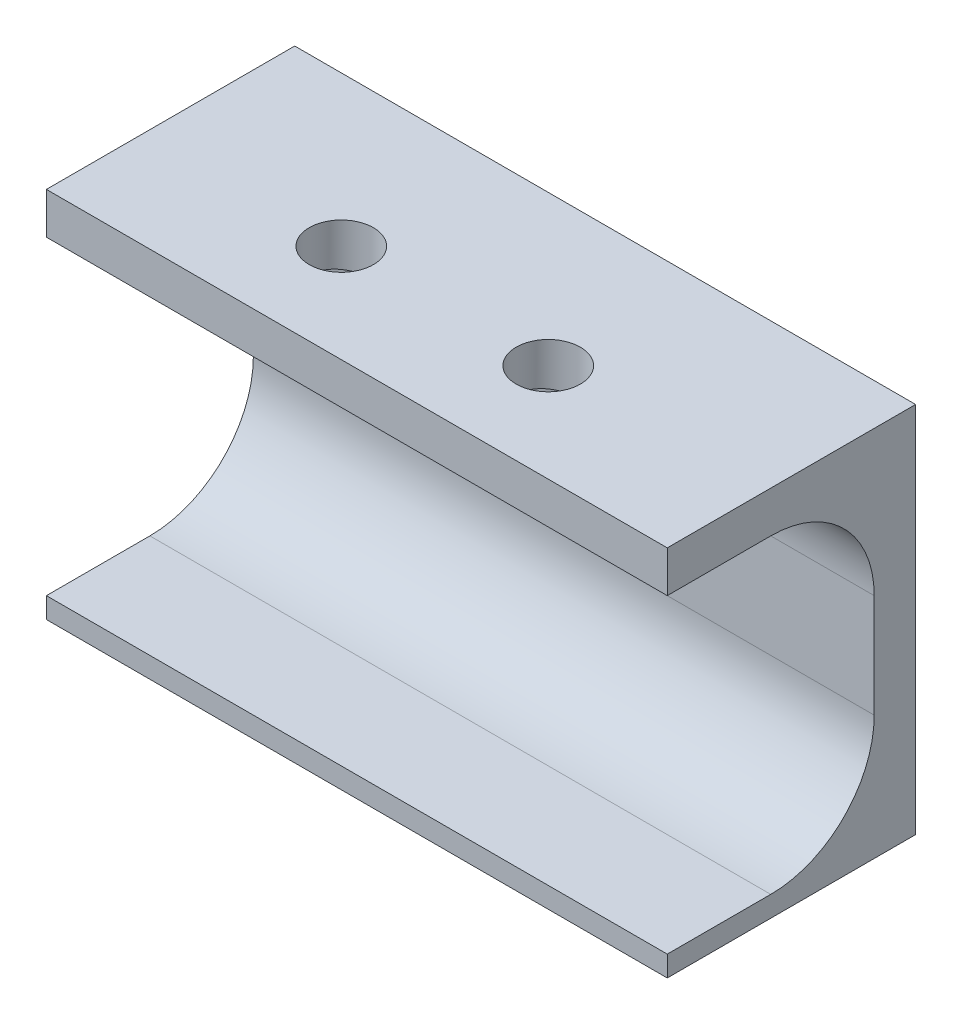
ISO-10303-21;
HEADER;
FILE_DESCRIPTION(('STEP AP214'),'2;1');
FILE_NAME('part.step','',(''),(''),'','','');
FILE_SCHEMA(('AUTOMOTIVE_DESIGN { 1 0 10303 214 1 1 1 1 }'));
ENDSEC;
DATA;
#1=APPLICATION_CONTEXT('core data for automotive mechanical design processes');
#2=APPLICATION_PROTOCOL_DEFINITION('international standard','automotive_design',2000,#1);
#3=PRODUCT_CONTEXT('',#1,'mechanical');
#4=PRODUCT('Part','Part','',(#3));
#5=PRODUCT_RELATED_PRODUCT_CATEGORY('part','',(#4));
#6=PRODUCT_DEFINITION_FORMATION('','',#4);
#7=PRODUCT_DEFINITION_CONTEXT('part definition',#1,'design');
#8=PRODUCT_DEFINITION('design','',#6,#7);
#9=PRODUCT_DEFINITION_SHAPE('','',#8);
#10=(LENGTH_UNIT() NAMED_UNIT(*) SI_UNIT(.MILLI.,.METRE.));
#11=(NAMED_UNIT(*) PLANE_ANGLE_UNIT() SI_UNIT($,.RADIAN.));
#12=(NAMED_UNIT(*) SI_UNIT($,.STERADIAN.) SOLID_ANGLE_UNIT());
#13=UNCERTAINTY_MEASURE_WITH_UNIT(LENGTH_MEASURE(1.E-05),#10,'distance_accuracy_value','');
#14=(GEOMETRIC_REPRESENTATION_CONTEXT(3) GLOBAL_UNCERTAINTY_ASSIGNED_CONTEXT((#13)) GLOBAL_UNIT_ASSIGNED_CONTEXT((#10,
#11,#12)) REPRESENTATION_CONTEXT('',''));
#15=CARTESIAN_POINT('',(0.,0.,0.));
#16=DIRECTION('',(0.,0.,1.));
#17=DIRECTION('',(1.,0.,0.));
#18=AXIS2_PLACEMENT_3D('',#15,#16,#17);
#19=CARTESIAN_POINT('',(30.,-1.39041349283809,11.5391489287265));
#20=DIRECTION('',(0.,0.,-1.));
#21=DIRECTION('',(-1.,0.,0.));
#22=AXIS2_PLACEMENT_3D('',#19,#20,#21);
#23=PLANE('',#22);
#24=DIRECTION('',(0.,-1.,0.));
#25=VECTOR('',#24,1.);
#26=CARTESIAN_POINT('',(0.,-1.39041349283809,11.5391489287265));
#27=LINE('',#26,#25);
#28=CARTESIAN_POINT('',(0.,-0.390413492838092,11.5391489287265));
#29=VERTEX_POINT('',#28);
#30=CARTESIAN_POINT('',(0.,-1.39041349283809,11.5391489287265));
#31=VERTEX_POINT('',#30);
#32=EDGE_CURVE('E230',#29,#31,#27,.T.);
#33=ORIENTED_EDGE('',*,*,#32,.T.);
#34=DIRECTION('',(-1.,0.,0.));
#35=VECTOR('',#34,1.);
#36=CARTESIAN_POINT('',(30.,-1.39041349283809,11.5391489287265));
#37=LINE('',#36,#35);
#38=CARTESIAN_POINT('',(30.,-1.39041349283809,11.5391489287265));
#39=VERTEX_POINT('',#38);
#40=EDGE_CURVE('E142',#39,#31,#37,.T.);
#41=ORIENTED_EDGE('',*,*,#40,.F.);
#42=DIRECTION('',(0.,-1.,0.));
#43=VECTOR('',#42,1.);
#44=CARTESIAN_POINT('',(30.,-1.39041349283809,11.5391489287265));
#45=LINE('',#44,#43);
#46=CARTESIAN_POINT('',(30.,-0.390413492838092,11.5391489287265));
#47=VERTEX_POINT('',#46);
#48=EDGE_CURVE('E270',#47,#39,#45,.T.);
#49=ORIENTED_EDGE('',*,*,#48,.F.);
#50=DIRECTION('',(-1.,0.,0.));
#51=VECTOR('',#50,1.);
#52=CARTESIAN_POINT('',(30.,-0.390413492838092,11.5391489287265));
#53=LINE('',#52,#51);
#54=EDGE_CURVE('E233',#47,#29,#53,.T.);
#55=ORIENTED_EDGE('',*,*,#54,.T.);
#56=EDGE_LOOP('',(#33,#41,#49,#55));
#57=FACE_BOUND('',#56,.T.);
#58=ADVANCED_FACE('F47',(#57),#23,.F.);
#59=CARTESIAN_POINT('',(30.,-1.39041349283809,11.5391489287265));
#60=DIRECTION('',(0.,1.,0.));
#61=DIRECTION('',(0.,0.,1.));
#62=AXIS2_PLACEMENT_3D('',#59,#60,#61);
#63=PLANE('',#62);
#64=DIRECTION('',(0.,0.,-1.));
#65=VECTOR('',#64,1.);
#66=CARTESIAN_POINT('',(0.,-1.39041349283809,11.5391489287265));
#67=LINE('',#66,#65);
#68=CARTESIAN_POINT('',(0.,-1.39041349283809,-0.460851071273454));
#69=VERTEX_POINT('',#68);
#70=EDGE_CURVE('E235',#31,#69,#67,.T.);
#71=ORIENTED_EDGE('',*,*,#70,.T.);
#72=DIRECTION('',(-1.,0.,0.));
#73=VECTOR('',#72,1.);
#74=CARTESIAN_POINT('',(30.,-1.39041349283809,-0.460851071273454));
#75=LINE('',#74,#73);
#76=CARTESIAN_POINT('',(30.,-1.39041349283809,-0.460851071273454));
#77=VERTEX_POINT('',#76);
#78=EDGE_CURVE('E175',#77,#69,#75,.T.);
#79=ORIENTED_EDGE('',*,*,#78,.F.);
#80=DIRECTION('',(0.,0.,-1.));
#81=VECTOR('',#80,1.);
#82=CARTESIAN_POINT('',(30.,-1.39041349283809,11.5391489287265));
#83=LINE('',#82,#81);
#84=EDGE_CURVE('E315',#39,#77,#83,.T.);
#85=ORIENTED_EDGE('',*,*,#84,.F.);
#86=ORIENTED_EDGE('',*,*,#40,.T.);
#87=EDGE_LOOP('',(#71,#79,#85,#86));
#88=FACE_BOUND('',#87,.T.);
#89=ADVANCED_FACE('F219',(#88),#63,.F.);
#90=CARTESIAN_POINT('',(30.,-1.39041349283809,-0.460851071273454));
#91=DIRECTION('',(0.,0.,1.));
#92=DIRECTION('',(1.,0.,0.));
#93=AXIS2_PLACEMENT_3D('',#90,#91,#92);
#94=PLANE('',#93);
#95=DIRECTION('',(0.,1.,0.));
#96=VECTOR('',#95,1.);
#97=CARTESIAN_POINT('',(0.,-1.39041349283809,-0.460851071273454));
#98=LINE('',#97,#96);
#99=CARTESIAN_POINT('',(0.,16.6095865071619,-0.460851071273454));
#100=VERTEX_POINT('',#99);
#101=EDGE_CURVE('E239',#69,#100,#98,.T.);
#102=ORIENTED_EDGE('',*,*,#101,.T.);
#103=DIRECTION('',(-1.,0.,0.));
#104=VECTOR('',#103,1.);
#105=CARTESIAN_POINT('',(30.,16.6095865071619,-0.460851071273454));
#106=LINE('',#105,#104);
#107=CARTESIAN_POINT('',(30.,16.6095865071619,-0.460851071273454));
#108=VERTEX_POINT('',#107);
#109=EDGE_CURVE('E171',#108,#100,#106,.T.);
#110=ORIENTED_EDGE('',*,*,#109,.F.);
#111=DIRECTION('',(0.,1.,0.));
#112=VECTOR('',#111,1.);
#113=CARTESIAN_POINT('',(30.,-1.39041349283809,-0.460851071273454));
#114=LINE('',#113,#112);
#115=EDGE_CURVE('E312',#77,#108,#114,.T.);
#116=ORIENTED_EDGE('',*,*,#115,.F.);
#117=ORIENTED_EDGE('',*,*,#78,.T.);
#118=EDGE_LOOP('',(#102,#110,#116,#117));
#119=FACE_BOUND('',#118,.T.);
#120=ADVANCED_FACE('F224',(#119),#94,.F.);
#121=CARTESIAN_POINT('',(30.,16.6095865071619,11.5391489287265));
#122=DIRECTION('',(0.,-1.,0.));
#123=DIRECTION('',(0.,0.,-1.));
#124=AXIS2_PLACEMENT_3D('',#121,#122,#123);
#125=PLANE('',#124);
#126=CARTESIAN_POINT('',(19.5,16.6095865071619,6.78914892872655));
#127=DIRECTION('',(0.,1.,0.));
#128=DIRECTION('',(0.,0.,1.));
#129=AXIS2_PLACEMENT_3D('',#126,#127,#128);
#130=CIRCLE('',#129,1.55);
#131=CARTESIAN_POINT('',(19.5,16.6095865071619,8.33914892872655));
#132=VERTEX_POINT('',#131);
#133=EDGE_CURVE('E320',#132,#132,#130,.T.);
#134=ORIENTED_EDGE('',*,*,#133,.F.);
#135=EDGE_LOOP('',(#134));
#136=FACE_BOUND('',#135,.T.);
#137=CARTESIAN_POINT('',(9.5,16.6095865071619,6.78914892872655));
#138=DIRECTION('',(0.,1.,0.));
#139=DIRECTION('',(0.,0.,1.));
#140=AXIS2_PLACEMENT_3D('',#137,#138,#139);
#141=CIRCLE('',#140,1.55);
#142=CARTESIAN_POINT('',(9.5,16.6095865071619,8.33914892872655));
#143=VERTEX_POINT('',#142);
#144=EDGE_CURVE('E150',#143,#143,#141,.T.);
#145=ORIENTED_EDGE('',*,*,#144,.F.);
#146=EDGE_LOOP('',(#145));
#147=FACE_BOUND('',#146,.T.);
#148=DIRECTION('',(0.,0.,1.));
#149=VECTOR('',#148,1.);
#150=CARTESIAN_POINT('',(0.,16.6095865071619,11.5391489287265));
#151=LINE('',#150,#149);
#152=CARTESIAN_POINT('',(0.,16.6095865071619,11.5391489287265));
#153=VERTEX_POINT('',#152);
#154=EDGE_CURVE('E248',#100,#153,#151,.T.);
#155=ORIENTED_EDGE('',*,*,#154,.T.);
#156=DIRECTION('',(-1.,0.,0.));
#157=VECTOR('',#156,1.);
#158=CARTESIAN_POINT('',(30.,16.6095865071619,11.5391489287265));
#159=LINE('',#158,#157);
#160=CARTESIAN_POINT('',(30.,16.6095865071619,11.5391489287265));
#161=VERTEX_POINT('',#160);
#162=EDGE_CURVE('E167',#161,#153,#159,.T.);
#163=ORIENTED_EDGE('',*,*,#162,.F.);
#164=DIRECTION('',(0.,0.,1.));
#165=VECTOR('',#164,1.);
#166=CARTESIAN_POINT('',(30.,16.6095865071619,11.5391489287265));
#167=LINE('',#166,#165);
#168=EDGE_CURVE('E309',#108,#161,#167,.T.);
#169=ORIENTED_EDGE('',*,*,#168,.F.);
#170=ORIENTED_EDGE('',*,*,#109,.T.);
#171=EDGE_LOOP('',(#155,#163,#169,#170));
#172=FACE_BOUND('',#171,.T.);
#173=ADVANCED_FACE('F328',(#136,#147,#172),#125,.F.);
#174=CARTESIAN_POINT('',(30.,14.6095865071619,11.5391489287265));
#175=DIRECTION('',(0.,0.,-1.));
#176=DIRECTION('',(-1.,0.,0.));
#177=AXIS2_PLACEMENT_3D('',#174,#175,#176);
#178=PLANE('',#177);
#179=DIRECTION('',(0.,-1.,0.));
#180=VECTOR('',#179,1.);
#181=CARTESIAN_POINT('',(0.,14.6095865071619,11.5391489287265));
#182=LINE('',#181,#180);
#183=CARTESIAN_POINT('',(0.,14.6095865071619,11.5391489287265));
#184=VERTEX_POINT('',#183);
#185=EDGE_CURVE('E251',#153,#184,#182,.T.);
#186=ORIENTED_EDGE('',*,*,#185,.T.);
#187=DIRECTION('',(-1.,0.,0.));
#188=VECTOR('',#187,1.);
#189=CARTESIAN_POINT('',(30.,14.6095865071619,11.5391489287265));
#190=LINE('',#189,#188);
#191=CARTESIAN_POINT('',(30.,14.6095865071619,11.5391489287265));
#192=VERTEX_POINT('',#191);
#193=EDGE_CURVE('E159',#192,#184,#190,.T.);
#194=ORIENTED_EDGE('',*,*,#193,.F.);
#195=DIRECTION('',(0.,-1.,0.));
#196=VECTOR('',#195,1.);
#197=CARTESIAN_POINT('',(30.,14.6095865071619,11.5391489287265));
#198=LINE('',#197,#196);
#199=EDGE_CURVE('E306',#161,#192,#198,.T.);
#200=ORIENTED_EDGE('',*,*,#199,.F.);
#201=ORIENTED_EDGE('',*,*,#162,.T.);
#202=EDGE_LOOP('',(#186,#194,#200,#201));
#203=FACE_BOUND('',#202,.T.);
#204=ADVANCED_FACE('F331',(#203),#178,.F.);
#205=CARTESIAN_POINT('',(30.,14.6095865071619,6.53914892872658));
#206=DIRECTION('',(0.,1.,0.));
#207=DIRECTION('',(0.,0.,1.));
#208=AXIS2_PLACEMENT_3D('',#205,#206,#207);
#209=PLANE('',#208);
#210=DIRECTION('',(-1.,0.,0.));
#211=VECTOR('',#210,1.);
#212=CARTESIAN_POINT('',(30.,14.6095865071619,6.53914892872658));
#213=LINE('',#212,#211);
#214=CARTESIAN_POINT('',(17.9702941459222,14.6095865071619,6.53914892872658));
#215=VERTEX_POINT('',#214);
#216=CARTESIAN_POINT('',(11.0297058540781,14.609586507162,6.53914892872657));
#217=VERTEX_POINT('',#216);
#218=EDGE_CURVE('E146',#215,#217,#213,.T.);
#219=ORIENTED_EDGE('',*,*,#218,.F.);
#220=CARTESIAN_POINT('',(19.5,14.6095865071619,6.78914892872655));
#221=DIRECTION('',(0.,1.,0.));
#222=DIRECTION('',(0.,0.,1.));
#223=AXIS2_PLACEMENT_3D('',#220,#221,#222);
#224=CIRCLE('',#223,1.55);
#225=CARTESIAN_POINT('',(21.0297058540781,14.609586507162,6.53914892872657));
#226=VERTEX_POINT('',#225);
#227=EDGE_CURVE('E73',#215,#226,#224,.T.);
#228=ORIENTED_EDGE('',*,*,#227,.T.);
#229=CARTESIAN_POINT('',(30.,14.6095865071619,6.53914892872658));
#230=VERTEX_POINT('',#229);
#231=EDGE_CURVE('E155',#230,#226,#213,.T.);
#232=ORIENTED_EDGE('',*,*,#231,.F.);
#233=DIRECTION('',(0.,0.,-1.));
#234=VECTOR('',#233,1.);
#235=CARTESIAN_POINT('',(30.,14.6095865071619,6.53914892872658));
#236=LINE('',#235,#234);
#237=EDGE_CURVE('E303',#192,#230,#236,.T.);
#238=ORIENTED_EDGE('',*,*,#237,.F.);
#239=ORIENTED_EDGE('',*,*,#193,.T.);
#240=DIRECTION('',(0.,0.,-1.));
#241=VECTOR('',#240,1.);
#242=CARTESIAN_POINT('',(0.,14.6095865071619,6.53914892872658));
#243=LINE('',#242,#241);
#244=CARTESIAN_POINT('',(0.,14.6095865071619,6.53914892872658));
#245=VERTEX_POINT('',#244);
#246=EDGE_CURVE('E254',#184,#245,#243,.T.);
#247=ORIENTED_EDGE('',*,*,#246,.T.);
#248=CARTESIAN_POINT('',(7.97029414592215,14.6095865071619,6.53914892872658));
#249=VERTEX_POINT('',#248);
#250=EDGE_CURVE('E148',#249,#245,#213,.T.);
#251=ORIENTED_EDGE('',*,*,#250,.F.);
#252=CARTESIAN_POINT('',(9.5,14.6095865071619,6.78914892872655));
#253=DIRECTION('',(0.,1.,0.));
#254=DIRECTION('',(0.,0.,1.));
#255=AXIS2_PLACEMENT_3D('',#252,#253,#254);
#256=CIRCLE('',#255,1.55);
#257=EDGE_CURVE('E66',#249,#217,#256,.T.);
#258=ORIENTED_EDGE('',*,*,#257,.T.);
#259=EDGE_LOOP('',(#219,#228,#232,#238,#239,#247,#251,#258));
#260=FACE_BOUND('',#259,.T.);
#261=ADVANCED_FACE('F145',(#260),#209,.F.);
#262=CARTESIAN_POINT('',(30.,9.60958650716191,6.53914892872654));
#263=DIRECTION('',(-1.,0.,0.));
#264=DIRECTION('',(0.,0.,1.));
#265=AXIS2_PLACEMENT_3D('',#262,#263,#264);
#266=CYLINDRICAL_SURFACE('',#265,5.);
#267=ORIENTED_EDGE('',*,*,#231,.T.);
#268=CARTESIAN_POINT('',(19.5,14.2743480230381,8.33914892872655));
#269=CARTESIAN_POINT('',(19.583812636224,14.27434859442,8.3391483529273));
#270=CARTESIAN_POINT('',(19.6676312475709,14.2769981719743,8.33232579615543));
#271=CARTESIAN_POINT('',(19.8327783805866,14.2872839938921,8.30531679619664));
#272=CARTESIAN_POINT('',(19.914106102559,14.2949218225162,8.28512610728377));
#273=CARTESIAN_POINT('',(20.0718244590497,14.3143002688451,8.23220916913269));
#274=CARTESIAN_POINT('',(20.1482257769633,14.3260316286716,8.19951119030275));
#275=CARTESIAN_POINT('',(20.2944552789729,14.3523953826047,8.12262911391381));
#276=CARTESIAN_POINT('',(20.3642821152772,14.3670283696534,8.07844266813246));
#277=CARTESIAN_POINT('',(20.4984985051366,14.3984544111944,7.97776950397644));
#278=CARTESIAN_POINT('',(20.5625546322904,14.4153108306379,7.92085813817671));
#279=CARTESIAN_POINT('',(20.68044141984,14.4491293541352,7.79729221683077));
#280=CARTESIAN_POINT('',(20.7342697631505,14.4660914812401,7.73063545952226));
#281=CARTESIAN_POINT('',(20.8322142602505,14.4992659210348,7.58638904836761));
#282=CARTESIAN_POINT('',(20.8758755796591,14.5154240563376,7.50847680840029));
#283=CARTESIAN_POINT('',(20.94932660668,14.54477254373,7.34584323072096));
#284=CARTESIAN_POINT('',(20.9791188784797,14.5579634441854,7.26112315507905));
#285=CARTESIAN_POINT('',(21.0231094435974,14.5799270238479,7.08959350598063));
#286=CARTESIAN_POINT('',(21.0376995993438,14.5888074014952,7.00289858473648));
#287=CARTESIAN_POINT('',(21.0519954626782,14.6020083956407,6.82795506292325));
#288=CARTESIAN_POINT('',(21.0517057148253,14.6063304039258,6.73970694495641));
#289=CARTESIAN_POINT('',(21.0364951788601,14.6102035207024,6.56834990305456));
#290=CARTESIAN_POINT('',(21.0222255635027,14.6099582312358,6.48518694907786));
#291=CARTESIAN_POINT('',(20.9804344670041,14.6055492340301,6.3223757131202));
#292=CARTESIAN_POINT('',(20.9529130129673,14.6013855343056,6.24272742395089));
#293=CARTESIAN_POINT('',(20.885525780513,14.5899003644532,6.08926981591149));
#294=CARTESIAN_POINT('',(20.8456820572694,14.5825845270939,6.0154503582297));
#295=CARTESIAN_POINT('',(20.7547694365412,14.5658304887091,5.87534874972764));
#296=CARTESIAN_POINT('',(20.7036983269214,14.5563918694229,5.80906808818916));
#297=CARTESIAN_POINT('',(20.5897129775504,14.5362538354937,5.68349899325304));
#298=CARTESIAN_POINT('',(20.5264497517689,14.5255220709898,5.62453233308916));
#299=CARTESIAN_POINT('',(20.3909631335654,14.5044794278614,5.51788214712628));
#300=CARTESIAN_POINT('',(20.3187385629809,14.4941686048161,5.47020010733557));
#301=CARTESIAN_POINT('',(20.1658602736771,14.475154320324,5.38670684952296));
#302=CARTESIAN_POINT('',(20.0850822467507,14.4664817853015,5.35111549561467));
#303=CARTESIAN_POINT('',(19.9184205744451,14.4521810086273,5.29409830412436));
#304=CARTESIAN_POINT('',(19.8325380731062,14.4465520876598,5.27266930535552));
#305=CARTESIAN_POINT('',(19.6603941882346,14.4392406347618,5.24506934888964));
#306=CARTESIAN_POINT('',(19.5741958245817,14.4374630622032,5.23853072433599));
#307=CARTESIAN_POINT('',(19.4019250288266,14.437820879499,5.23985910436087));
#308=CARTESIAN_POINT('',(19.3158525830755,14.4399558080499,5.24772441064311));
#309=CARTESIAN_POINT('',(19.1481991563975,14.4477516147684,5.27725349338574));
#310=CARTESIAN_POINT('',(19.0665614341947,14.4533358722248,5.29861764721845));
#311=CARTESIAN_POINT('',(18.9080266314186,14.4672270550922,5.35418360872027));
#312=CARTESIAN_POINT('',(18.831130197898,14.4755343511487,5.38838716411214));
#313=CARTESIAN_POINT('',(18.6825197595201,14.4940062927464,5.46947570866195));
#314=CARTESIAN_POINT('',(18.6109437439083,14.5042054196642,5.51660552626001));
#315=CARTESIAN_POINT('',(18.4765441606091,14.5250356673046,5.62195925450851));
#316=CARTESIAN_POINT('',(18.4137222132567,14.5356668675327,5.68018521429052));
#317=CARTESIAN_POINT('',(18.2969010868894,14.5562666937786,5.80795490561229));
#318=CARTESIAN_POINT('',(18.2431809592882,14.5662101816435,5.87775843440256));
#319=CARTESIAN_POINT('',(18.1482179189563,14.5837066619056,6.02566623734037));
#320=CARTESIAN_POINT('',(18.1069735567331,14.5912599320143,6.10376954575486));
#321=CARTESIAN_POINT('',(18.0387735402008,14.6027015494303,6.26488287111799));
#322=CARTESIAN_POINT('',(18.0116163250693,14.6066422519547,6.34780364551427));
#323=CARTESIAN_POINT('',(17.9715843754391,14.6102537882602,6.51710652719785));
#324=CARTESIAN_POINT('',(17.9587059411822,14.609925728396,6.60348773184382));
#325=CARTESIAN_POINT('',(17.9478033621475,14.6047709721505,6.77400090297998));
#326=CARTESIAN_POINT('',(17.9492757735809,14.6001019094831,6.85810596075872));
#327=CARTESIAN_POINT('',(17.9657107104155,14.5866613568438,7.02464485887028));
#328=CARTESIAN_POINT('',(17.9806733023262,14.577889846646,7.10707869096155));
#329=CARTESIAN_POINT('',(18.0235032277357,14.5568297084419,7.26811423308126));
#330=CARTESIAN_POINT('',(18.0513822454574,14.5445378998194,7.34671240205565));
#331=CARTESIAN_POINT('',(18.1191297769041,14.5173741578726,7.49807579734838));
#332=CARTESIAN_POINT('',(18.1590009561709,14.5025016512383,7.57083972230886));
#333=CARTESIAN_POINT('',(18.2516050647291,14.4706724328763,7.71187931732193));
#334=CARTESIAN_POINT('',(18.3048197682985,14.4536533920185,7.77982466336429));
#335=CARTESIAN_POINT('',(18.4217703148077,14.4195799354763,7.90598531787528));
#336=CARTESIAN_POINT('',(18.4855097388984,14.4025255097089,7.96419730084505));
#337=CARTESIAN_POINT('',(18.6241757275476,14.3694644599058,8.07107393714205));
#338=CARTESIAN_POINT('',(18.6993912312456,14.3535077016645,8.11938047618083));
#339=CARTESIAN_POINT('',(18.8575017711319,14.3249961213562,8.20253583227658));
#340=CARTESIAN_POINT('',(18.9403923567539,14.3124393441091,8.23739238875257));
#341=CARTESIAN_POINT('',(19.1020908025213,14.2933368222943,8.28933862336808));
#342=CARTESIAN_POINT('',(19.1803485621018,14.2862826700204,8.30795819307183));
#343=CARTESIAN_POINT('',(19.3390695166164,14.2767887272573,8.33286166753839));
#344=CARTESIAN_POINT('',(19.4195320044333,14.274347474458,8.33914948154786));
#345=CARTESIAN_POINT('',(19.5,14.2743480230381,8.33914892872655));
#346=B_SPLINE_CURVE_WITH_KNOTS('',3,(#268,#269,#270,#271,#272,#273,#274,#275,#276,#277,#278,
#279,#280,#281,#282,#283,#284,#285,#286,#287,#288,#289,#290,#291,#292,#293,#294,#295,#296,#297,
#298,#299,#300,#301,#302,#303,#304,#305,#306,#307,#308,#309,#310,#311,#312,#313,#314,#315,#316,
#317,#318,#319,#320,#321,#322,#323,#324,#325,#326,#327,#328,#329,#330,#331,#332,#333,#334,#335,
#336,#337,#338,#339,#340,#341,#342,#343,#344,#345),.UNSPECIFIED.,.T.,.F.,(4,2,2,2,2,2,2,2,2,2,2,
2,2,2,2,2,2,2,2,2,2,2,2,2,2,2,2,2,2,2,2,2,2,2,2,2,2,2,4),(0.,0.251136874663182,
0.502353548818156,0.753005717991314,1.00370916035691,1.26453630573832,1.52542247074625,
1.79637398374811,2.06727538179611,2.33100671371117,2.59465749836616,2.84658449902228,
3.09851098440248,3.34998914030392,3.60151688949901,3.8617582183283,4.12203379783227,
4.38681653634334,4.65154015257914,4.90965297507309,5.16773536671921,5.42028140550854,
5.67286183379821,5.93060299050674,6.18839179064185,6.45303598169015,6.71764941332237,
6.97836433892476,7.23901169518994,7.49054910113426,7.74208774722063,7.99385438125139,
8.24567701778437,8.50839326070759,8.77119908060667,9.04227557775174,9.3131958580124,
9.55438729543485,9.79550226123812),.UNSPECIFIED.);
#347=EDGE_CURVE('E12',#226,#215,#346,.T.);
#348=ORIENTED_EDGE('',*,*,#347,.T.);
#349=ORIENTED_EDGE('',*,*,#218,.T.);
#350=CARTESIAN_POINT('',(9.5,14.2743480230381,8.33914892872655));
#351=CARTESIAN_POINT('',(9.58381263622401,14.27434859442,8.3391483529273));
#352=CARTESIAN_POINT('',(9.66763124757091,14.2769981719743,8.33232579615543));
#353=CARTESIAN_POINT('',(9.83277838058659,14.2872839938921,8.30531679619664));
#354=CARTESIAN_POINT('',(9.91410610255904,14.2949218225162,8.28512610728377));
#355=CARTESIAN_POINT('',(10.0718244590497,14.3143002688451,8.23220916913269));
#356=CARTESIAN_POINT('',(10.1482257769633,14.3260316286716,8.19951119030275));
#357=CARTESIAN_POINT('',(10.2944552789729,14.3523953826047,8.12262911391381));
#358=CARTESIAN_POINT('',(10.3642821152772,14.3670283696534,8.07844266813246));
#359=CARTESIAN_POINT('',(10.4984985051366,14.3984544111944,7.97776950397644));
#360=CARTESIAN_POINT('',(10.5625546322904,14.4153108306379,7.92085813817671));
#361=CARTESIAN_POINT('',(10.68044141984,14.4491293541352,7.79729221683077));
#362=CARTESIAN_POINT('',(10.7342697631505,14.4660914812401,7.73063545952226));
#363=CARTESIAN_POINT('',(10.8322142602504,14.4992659210348,7.58638904836761));
#364=CARTESIAN_POINT('',(10.8758755796591,14.5154240563376,7.50847680840029));
#365=CARTESIAN_POINT('',(10.94932660668,14.54477254373,7.34584323072096));
#366=CARTESIAN_POINT('',(10.9791188784797,14.5579634441854,7.26112315507905));
#367=CARTESIAN_POINT('',(11.0231094435974,14.5799270238479,7.08959350598064));
#368=CARTESIAN_POINT('',(11.0376995993438,14.5888074014952,7.00289858473649));
#369=CARTESIAN_POINT('',(11.0519954626782,14.6020083956407,6.82795506292326));
#370=CARTESIAN_POINT('',(11.0517057148253,14.6063304039258,6.73970694495641));
#371=CARTESIAN_POINT('',(11.0364951788601,14.6102035207024,6.56834990305456));
#372=CARTESIAN_POINT('',(11.0222255635027,14.6099582312358,6.48518694907786));
#373=CARTESIAN_POINT('',(10.9804344670041,14.6055492340301,6.3223757131202));
#374=CARTESIAN_POINT('',(10.9529130129673,14.6013855343056,6.24272742395089));
#375=CARTESIAN_POINT('',(10.885525780513,14.5899003644532,6.08926981591149));
#376=CARTESIAN_POINT('',(10.8456820572694,14.5825845270939,6.01545035822971));
#377=CARTESIAN_POINT('',(10.7547694365412,14.5658304887091,5.87534874972765));
#378=CARTESIAN_POINT('',(10.7036983269214,14.5563918694229,5.80906808818916));
#379=CARTESIAN_POINT('',(10.5897129775504,14.5362538354937,5.68349899325304));
#380=CARTESIAN_POINT('',(10.5264497517689,14.5255220709898,5.62453233308916));
#381=CARTESIAN_POINT('',(10.3909631335654,14.5044794278614,5.51788214712628));
#382=CARTESIAN_POINT('',(10.3187385629809,14.4941686048161,5.47020010733557));
#383=CARTESIAN_POINT('',(10.1658602736771,14.475154320324,5.38670684952297));
#384=CARTESIAN_POINT('',(10.0850822467507,14.4664817853015,5.35111549561467));
#385=CARTESIAN_POINT('',(9.91842057444511,14.4521810086273,5.29409830412436));
#386=CARTESIAN_POINT('',(9.83253807310617,14.4465520876599,5.27266930535552));
#387=CARTESIAN_POINT('',(9.66039418823457,14.4392406347618,5.24506934888964));
#388=CARTESIAN_POINT('',(9.5741958245817,14.4374630622032,5.23853072433599));
#389=CARTESIAN_POINT('',(9.40192502882658,14.437820879499,5.23985910436088));
#390=CARTESIAN_POINT('',(9.31585258307546,14.4399558080499,5.24772441064311));
#391=CARTESIAN_POINT('',(9.14819915639745,14.4477516147684,5.27725349338575));
#392=CARTESIAN_POINT('',(9.06656143419472,14.4533358722248,5.29861764721845));
#393=CARTESIAN_POINT('',(8.90802663141863,14.4672270550922,5.35418360872027));
#394=CARTESIAN_POINT('',(8.83113019789797,14.4755343511487,5.38838716411214));
#395=CARTESIAN_POINT('',(8.68251975952014,14.4940062927464,5.46947570866195));
#396=CARTESIAN_POINT('',(8.61094374390828,14.5042054196642,5.51660552626002));
#397=CARTESIAN_POINT('',(8.47654416060913,14.5250356673046,5.62195925450851));
#398=CARTESIAN_POINT('',(8.41372221325668,14.5356668675327,5.68018521429052));
#399=CARTESIAN_POINT('',(8.29690108688937,14.5562666937786,5.80795490561229));
#400=CARTESIAN_POINT('',(8.24318095928816,14.5662101816435,5.87775843440256));
#401=CARTESIAN_POINT('',(8.14821791895631,14.5837066619056,6.02566623734037));
#402=CARTESIAN_POINT('',(8.10697355673312,14.5912599320143,6.10376954575486));
#403=CARTESIAN_POINT('',(8.03877354020075,14.6027015494303,6.264882871118));
#404=CARTESIAN_POINT('',(8.01161632506929,14.6066422519547,6.34780364551427));
#405=CARTESIAN_POINT('',(7.97158437543909,14.6102537882602,6.51710652719786));
#406=CARTESIAN_POINT('',(7.9587059411822,14.609925728396,6.60348773184382));
#407=CARTESIAN_POINT('',(7.94780336214746,14.6047709721505,6.77400090297999));
#408=CARTESIAN_POINT('',(7.94927577358095,14.6001019094831,6.85810596075872));
#409=CARTESIAN_POINT('',(7.96571071041553,14.5866613568438,7.02464485887029));
#410=CARTESIAN_POINT('',(7.98067330232621,14.577889846646,7.10707869096155));
#411=CARTESIAN_POINT('',(8.02350322773569,14.5568297084419,7.26811423308126));
#412=CARTESIAN_POINT('',(8.05138224545737,14.5445378998194,7.34671240205565));
#413=CARTESIAN_POINT('',(8.11912977690408,14.5173741578726,7.49807579734838));
#414=CARTESIAN_POINT('',(8.15900095617091,14.5025016512383,7.57083972230886));
#415=CARTESIAN_POINT('',(8.25160506472908,14.4706724328763,7.71187931732193));
#416=CARTESIAN_POINT('',(8.30481976829853,14.4536533920185,7.77982466336429));
#417=CARTESIAN_POINT('',(8.42177031480771,14.4195799354763,7.90598531787528));
#418=CARTESIAN_POINT('',(8.48550973889841,14.4025255097089,7.96419730084505));
#419=CARTESIAN_POINT('',(8.62417572754758,14.3694644599058,8.07107393714205));
#420=CARTESIAN_POINT('',(8.69939123124561,14.3535077016645,8.11938047618083));
#421=CARTESIAN_POINT('',(8.85750177113192,14.3249961213562,8.20253583227659));
#422=CARTESIAN_POINT('',(8.94039235675388,14.3124393441091,8.23739238875256));
#423=CARTESIAN_POINT('',(9.10209080252135,14.2933368222943,8.28933862336808));
#424=CARTESIAN_POINT('',(9.18034856210177,14.2862826700204,8.30795819307183));
#425=CARTESIAN_POINT('',(9.33906951661639,14.2767887272573,8.33286166753839));
#426=CARTESIAN_POINT('',(9.41953200443328,14.274347474458,8.33914948154785));
#427=CARTESIAN_POINT('',(9.5,14.2743480230381,8.33914892872655));
#428=B_SPLINE_CURVE_WITH_KNOTS('',3,(#350,#351,#352,#353,#354,#355,#356,#357,#358,#359,#360,
#361,#362,#363,#364,#365,#366,#367,#368,#369,#370,#371,#372,#373,#374,#375,#376,#377,#378,#379,
#380,#381,#382,#383,#384,#385,#386,#387,#388,#389,#390,#391,#392,#393,#394,#395,#396,#397,#398,
#399,#400,#401,#402,#403,#404,#405,#406,#407,#408,#409,#410,#411,#412,#413,#414,#415,#416,#417,
#418,#419,#420,#421,#422,#423,#424,#425,#426,#427),.UNSPECIFIED.,.T.,.F.,(4,2,2,2,2,2,2,2,2,2,2,
2,2,2,2,2,2,2,2,2,2,2,2,2,2,2,2,2,2,2,2,2,2,2,2,2,2,2,4),(0.,0.251136874663177,
0.502353548818154,0.753005717991312,1.0037091603569,1.26453630573832,1.52542247074625,
1.79637398374811,2.06727538179611,2.33100671371116,2.59465749836616,2.84658449902228,
3.09851098440247,3.34998914030392,3.60151688949901,3.8617582183283,4.12203379783226,
4.38681653634333,4.65154015257914,4.90965297507309,5.1677353667192,5.42028140550853,
5.6728618337982,5.93060299050673,6.18839179064184,6.45303598169014,6.71764941332237,
6.97836433892476,7.23901169518993,7.49054910113425,7.74208774722062,7.99385438125138,
8.24567701778437,8.50839326070758,8.77119908060666,9.04227557775173,9.31319585801239,
9.55438729543484,9.79550226123811),.UNSPECIFIED.);
#429=EDGE_CURVE('E60',#217,#249,#428,.T.);
#430=ORIENTED_EDGE('',*,*,#429,.T.);
#431=ORIENTED_EDGE('',*,*,#250,.T.);
#432=CARTESIAN_POINT('',(0.,9.60958650716191,6.53914892872654));
#433=DIRECTION('',(-1.,0.,0.));
#434=DIRECTION('',(0.,0.,-1.));
#435=AXIS2_PLACEMENT_3D('',#432,#433,#434);
#436=CIRCLE('',#435,5.);
#437=CARTESIAN_POINT('',(0.,9.60958650716187,1.53914892872654));
#438=VERTEX_POINT('',#437);
#439=EDGE_CURVE('E257',#245,#438,#436,.T.);
#440=ORIENTED_EDGE('',*,*,#439,.T.);
#441=DIRECTION('',(-1.,0.,0.));
#442=VECTOR('',#441,1.);
#443=CARTESIAN_POINT('',(30.,9.60958650716187,1.53914892872654));
#444=LINE('',#443,#442);
#445=CARTESIAN_POINT('',(30.,9.60958650716187,1.53914892872654));
#446=VERTEX_POINT('',#445);
#447=EDGE_CURVE('E160',#446,#438,#444,.T.);
#448=ORIENTED_EDGE('',*,*,#447,.F.);
#449=CARTESIAN_POINT('',(30.,9.60958650716191,6.53914892872654));
#450=DIRECTION('',(-1.,0.,0.));
#451=DIRECTION('',(0.,0.,-1.));
#452=AXIS2_PLACEMENT_3D('',#449,#450,#451);
#453=CIRCLE('',#452,5.);
#454=EDGE_CURVE('E298',#230,#446,#453,.T.);
#455=ORIENTED_EDGE('',*,*,#454,.F.);
#456=EDGE_LOOP('',(#267,#348,#349,#430,#431,#440,#448,#455));
#457=FACE_BOUND('',#456,.T.);
#458=ADVANCED_FACE('F153',(#457),#266,.F.);
#459=CARTESIAN_POINT('',(30.,4.60958650716191,1.53914892872655));
#460=DIRECTION('',(0.,0.,-1.));
#461=DIRECTION('',(-1.,0.,0.));
#462=AXIS2_PLACEMENT_3D('',#459,#460,#461);
#463=PLANE('',#462);
#464=DIRECTION('',(0.,-1.,0.));
#465=VECTOR('',#464,1.);
#466=CARTESIAN_POINT('',(0.,4.60958650716191,1.53914892872655));
#467=LINE('',#466,#465);
#468=CARTESIAN_POINT('',(0.,4.60958650716191,1.53914892872655));
#469=VERTEX_POINT('',#468);
#470=EDGE_CURVE('E260',#438,#469,#467,.T.);
#471=ORIENTED_EDGE('',*,*,#470,.T.);
#472=DIRECTION('',(-1.,0.,0.));
#473=VECTOR('',#472,1.);
#474=CARTESIAN_POINT('',(30.,4.60958650716191,1.53914892872655));
#475=LINE('',#474,#473);
#476=CARTESIAN_POINT('',(30.,4.60958650716191,1.53914892872655));
#477=VERTEX_POINT('',#476);
#478=EDGE_CURVE('E276',#477,#469,#475,.T.);
#479=ORIENTED_EDGE('',*,*,#478,.F.);
#480=DIRECTION('',(0.,-1.,0.));
#481=VECTOR('',#480,1.);
#482=CARTESIAN_POINT('',(30.,4.60958650716191,1.53914892872655));
#483=LINE('',#482,#481);
#484=EDGE_CURVE('E287',#446,#477,#483,.T.);
#485=ORIENTED_EDGE('',*,*,#484,.F.);
#486=ORIENTED_EDGE('',*,*,#447,.T.);
#487=EDGE_LOOP('',(#471,#479,#485,#486));
#488=FACE_BOUND('',#487,.T.);
#489=ADVANCED_FACE('F210',(#488),#463,.F.);
#490=CARTESIAN_POINT('',(30.,4.60958650716191,6.53914892872655));
#491=DIRECTION('',(-1.,0.,0.));
#492=DIRECTION('',(0.,0.,1.));
#493=AXIS2_PLACEMENT_3D('',#490,#491,#492);
#494=CYLINDRICAL_SURFACE('',#493,5.);
#495=CARTESIAN_POINT('',(0.,4.60958650716191,6.53914892872655));
#496=DIRECTION('',(-1.,0.,0.));
#497=DIRECTION('',(0.,0.,-1.));
#498=AXIS2_PLACEMENT_3D('',#495,#496,#497);
#499=CIRCLE('',#498,5.);
#500=CARTESIAN_POINT('',(0.,-0.390413492838091,6.53914892872662));
#501=VERTEX_POINT('',#500);
#502=EDGE_CURVE('E263',#469,#501,#499,.T.);
#503=ORIENTED_EDGE('',*,*,#502,.T.);
#504=DIRECTION('',(-1.,0.,0.));
#505=VECTOR('',#504,1.);
#506=CARTESIAN_POINT('',(30.,-0.390413492838091,6.53914892872662));
#507=LINE('',#506,#505);
#508=CARTESIAN_POINT('',(30.,-0.390413492838091,6.53914892872662));
#509=VERTEX_POINT('',#508);
#510=EDGE_CURVE('E273',#509,#501,#507,.T.);
#511=ORIENTED_EDGE('',*,*,#510,.F.);
#512=CARTESIAN_POINT('',(30.,4.60958650716191,6.53914892872655));
#513=DIRECTION('',(-1.,0.,0.));
#514=DIRECTION('',(0.,0.,-1.));
#515=AXIS2_PLACEMENT_3D('',#512,#513,#514);
#516=CIRCLE('',#515,5.);
#517=EDGE_CURVE('E295',#477,#509,#516,.T.);
#518=ORIENTED_EDGE('',*,*,#517,.F.);
#519=ORIENTED_EDGE('',*,*,#478,.T.);
#520=EDGE_LOOP('',(#503,#511,#518,#519));
#521=FACE_BOUND('',#520,.T.);
#522=ADVANCED_FACE('F207',(#521),#494,.F.);
#523=CARTESIAN_POINT('',(30.,-0.390413492838091,8.53914892872651));
#524=DIRECTION('',(0.,-1.,0.));
#525=DIRECTION('',(0.,0.,-1.));
#526=AXIS2_PLACEMENT_3D('',#523,#524,#525);
#527=PLANE('',#526);
#528=DIRECTION('',(0.,0.,1.));
#529=VECTOR('',#528,1.);
#530=CARTESIAN_POINT('',(0.,-0.390413492838091,8.53914892872651));
#531=LINE('',#530,#529);
#532=EDGE_CURVE('E267',#501,#29,#531,.T.);
#533=ORIENTED_EDGE('',*,*,#532,.T.);
#534=ORIENTED_EDGE('',*,*,#54,.F.);
#535=DIRECTION('',(0.,0.,1.));
#536=VECTOR('',#535,1.);
#537=CARTESIAN_POINT('',(30.,-0.390413492838091,6.53914892872662));
#538=LINE('',#537,#536);
#539=EDGE_CURVE('E243',#509,#47,#538,.T.);
#540=ORIENTED_EDGE('',*,*,#539,.F.);
#541=ORIENTED_EDGE('',*,*,#510,.T.);
#542=EDGE_LOOP('',(#533,#534,#540,#541));
#543=FACE_BOUND('',#542,.T.);
#544=ADVANCED_FACE('F200',(#543),#527,.F.);
#545=CARTESIAN_POINT('',(30.,4.60958650716191,6.53914892872655));
#546=DIRECTION('',(1.,0.,0.));
#547=DIRECTION('',(0.,0.,-1.));
#548=AXIS2_PLACEMENT_3D('',#545,#546,#547);
#549=PLANE('',#548);
#550=ORIENTED_EDGE('',*,*,#48,.T.);
#551=ORIENTED_EDGE('',*,*,#84,.T.);
#552=ORIENTED_EDGE('',*,*,#115,.T.);
#553=ORIENTED_EDGE('',*,*,#168,.T.);
#554=ORIENTED_EDGE('',*,*,#199,.T.);
#555=ORIENTED_EDGE('',*,*,#237,.T.);
#556=ORIENTED_EDGE('',*,*,#454,.T.);
#557=ORIENTED_EDGE('',*,*,#484,.T.);
#558=ORIENTED_EDGE('',*,*,#517,.T.);
#559=ORIENTED_EDGE('',*,*,#539,.T.);
#560=EDGE_LOOP('',(#550,#551,#552,#553,#554,#555,#556,#557,#558,#559));
#561=FACE_BOUND('',#560,.T.);
#562=ADVANCED_FACE('F197',(#561),#549,.T.);
#563=CARTESIAN_POINT('',(0.,4.60958650716191,6.53914892872655));
#564=DIRECTION('',(1.,0.,0.));
#565=DIRECTION('',(0.,0.,-1.));
#566=AXIS2_PLACEMENT_3D('',#563,#564,#565);
#567=PLANE('',#566);
#568=ORIENTED_EDGE('',*,*,#32,.F.);
#569=ORIENTED_EDGE('',*,*,#532,.F.);
#570=ORIENTED_EDGE('',*,*,#502,.F.);
#571=ORIENTED_EDGE('',*,*,#470,.F.);
#572=ORIENTED_EDGE('',*,*,#439,.F.);
#573=ORIENTED_EDGE('',*,*,#246,.F.);
#574=ORIENTED_EDGE('',*,*,#185,.F.);
#575=ORIENTED_EDGE('',*,*,#154,.F.);
#576=ORIENTED_EDGE('',*,*,#101,.F.);
#577=ORIENTED_EDGE('',*,*,#70,.F.);
#578=EDGE_LOOP('',(#568,#569,#570,#571,#572,#573,#574,#575,#576,#577));
#579=FACE_BOUND('',#578,.T.);
#580=ADVANCED_FACE('F191',(#579),#567,.F.);
#581=CARTESIAN_POINT('',(9.5,11.6095865071619,6.78914892872655));
#582=DIRECTION('',(0.,1.,0.));
#583=DIRECTION('',(0.,0.,1.));
#584=AXIS2_PLACEMENT_3D('',#581,#582,#583);
#585=CYLINDRICAL_SURFACE('',#584,1.55);
#586=ORIENTED_EDGE('',*,*,#144,.T.);
#587=EDGE_LOOP('',(#586));
#588=FACE_BOUND('',#587,.T.);
#589=ORIENTED_EDGE('',*,*,#429,.F.);
#590=ORIENTED_EDGE('',*,*,#257,.F.);
#591=EDGE_LOOP('',(#589,#590));
#592=FACE_BOUND('',#591,.T.);
#593=ADVANCED_FACE('F137',(#588,#592),#585,.F.);
#594=CARTESIAN_POINT('',(19.5,11.6095865071619,6.78914892872655));
#595=DIRECTION('',(0.,1.,0.));
#596=DIRECTION('',(0.,0.,1.));
#597=AXIS2_PLACEMENT_3D('',#594,#595,#596);
#598=CYLINDRICAL_SURFACE('',#597,1.55);
#599=ORIENTED_EDGE('',*,*,#133,.T.);
#600=EDGE_LOOP('',(#599));
#601=FACE_BOUND('',#600,.T.);
#602=ORIENTED_EDGE('',*,*,#347,.F.);
#603=ORIENTED_EDGE('',*,*,#227,.F.);
#604=EDGE_LOOP('',(#602,#603));
#605=FACE_BOUND('',#604,.T.);
#606=ADVANCED_FACE('F190',(#601,#605),#598,.F.);
#607=CLOSED_SHELL('',(#58,#89,#120,#173,#204,#261,#458,#489,#522,#544,#562,#580,#593,#606));
#608=MANIFOLD_SOLID_BREP('B2',#607);
#609=ADVANCED_BREP_SHAPE_REPRESENTATION('',(#18,#608),#14);
#610=SHAPE_DEFINITION_REPRESENTATION(#9,#609);
ENDSEC;
END-ISO-10303-21;
